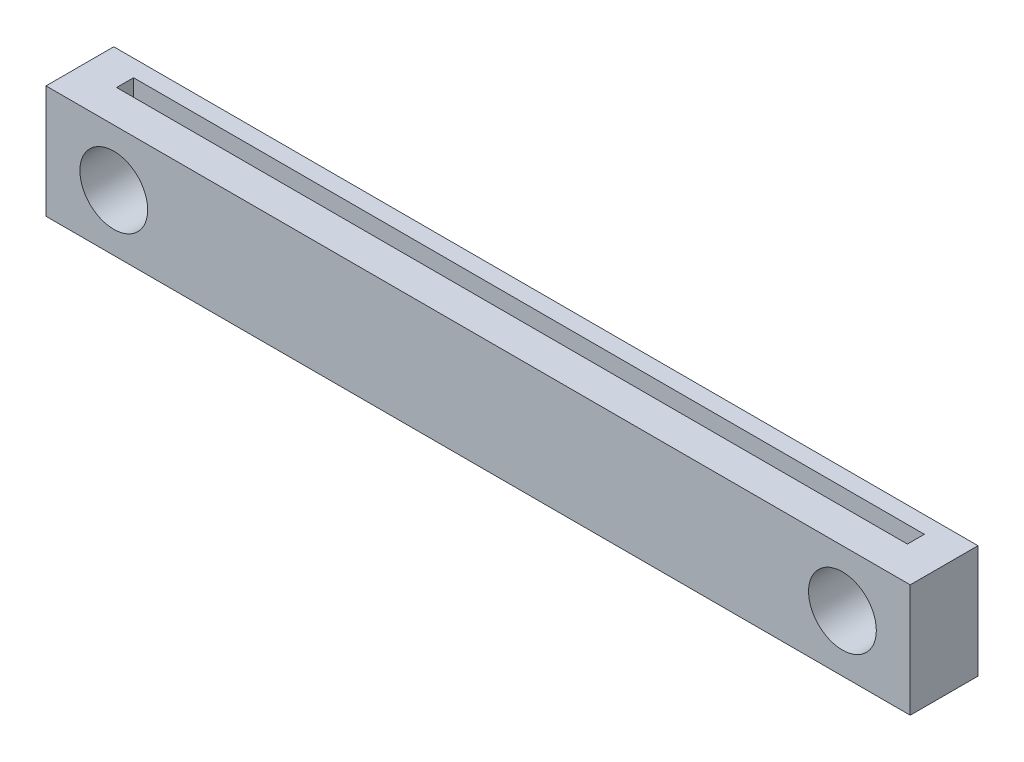
ISO-10303-21;
HEADER;
FILE_DESCRIPTION(('STEP AP214'),'2;1');
FILE_NAME('part.step','',(''),(''),'','','');
FILE_SCHEMA(('AUTOMOTIVE_DESIGN { 1 0 10303 214 1 1 1 1 }'));
ENDSEC;
DATA;
#1=APPLICATION_CONTEXT('core data for automotive mechanical design processes');
#2=APPLICATION_PROTOCOL_DEFINITION('international standard','automotive_design',2000,#1);
#3=PRODUCT_CONTEXT('',#1,'mechanical');
#4=PRODUCT('Part','Part','',(#3));
#5=PRODUCT_RELATED_PRODUCT_CATEGORY('part','',(#4));
#6=PRODUCT_DEFINITION_FORMATION('','',#4);
#7=PRODUCT_DEFINITION_CONTEXT('part definition',#1,'design');
#8=PRODUCT_DEFINITION('design','',#6,#7);
#9=PRODUCT_DEFINITION_SHAPE('','',#8);
#10=(LENGTH_UNIT() NAMED_UNIT(*) SI_UNIT(.MILLI.,.METRE.));
#11=(NAMED_UNIT(*) PLANE_ANGLE_UNIT() SI_UNIT($,.RADIAN.));
#12=(NAMED_UNIT(*) SI_UNIT($,.STERADIAN.) SOLID_ANGLE_UNIT());
#13=UNCERTAINTY_MEASURE_WITH_UNIT(LENGTH_MEASURE(1.E-05),#10,'distance_accuracy_value','');
#14=(GEOMETRIC_REPRESENTATION_CONTEXT(3) GLOBAL_UNCERTAINTY_ASSIGNED_CONTEXT((#13)) GLOBAL_UNIT_ASSIGNED_CONTEXT((#10,
#11,#12)) REPRESENTATION_CONTEXT('',''));
#15=CARTESIAN_POINT('',(0.,0.,0.));
#16=DIRECTION('',(0.,0.,1.));
#17=DIRECTION('',(1.,0.,0.));
#18=AXIS2_PLACEMENT_3D('',#15,#16,#17);
#19=CARTESIAN_POINT('',(-35.,-5.,6.));
#20=DIRECTION('',(0.,1.,0.));
#21=DIRECTION('',(0.,0.,1.));
#22=AXIS2_PLACEMENT_3D('',#19,#20,#21);
#23=PLANE('',#22);
#24=DIRECTION('',(-1.,0.,0.));
#25=VECTOR('',#24,1.);
#26=CARTESIAN_POINT('',(35.,-5.,3.));
#27=LINE('',#26,#25);
#28=CARTESIAN_POINT('',(35.,-5.,3.));
#29=VERTEX_POINT('',#28);
#30=CARTESIAN_POINT('',(-35.,-5.,3.));
#31=VERTEX_POINT('',#30);
#32=EDGE_CURVE('E151',#29,#31,#27,.T.);
#33=ORIENTED_EDGE('',*,*,#32,.F.);
#34=DIRECTION('',(0.,0.,1.));
#35=VECTOR('',#34,1.);
#36=CARTESIAN_POINT('',(35.,-5.,0.));
#37=LINE('',#36,#35);
#38=CARTESIAN_POINT('',(35.,-5.,1.5));
#39=VERTEX_POINT('',#38);
#40=EDGE_CURVE('E231',#39,#29,#37,.T.);
#41=ORIENTED_EDGE('',*,*,#40,.F.);
#42=DIRECTION('',(-1.,0.,0.));
#43=VECTOR('',#42,1.);
#44=CARTESIAN_POINT('',(35.,-5.,1.5));
#45=LINE('',#44,#43);
#46=CARTESIAN_POINT('',(-35.,-5.,1.5));
#47=VERTEX_POINT('',#46);
#48=EDGE_CURVE('E153',#39,#47,#45,.T.);
#49=ORIENTED_EDGE('',*,*,#48,.T.);
#50=DIRECTION('',(0.,0.,1.));
#51=VECTOR('',#50,1.);
#52=CARTESIAN_POINT('',(-35.,-5.,0.));
#53=LINE('',#52,#51);
#54=EDGE_CURVE('E208',#47,#31,#53,.T.);
#55=ORIENTED_EDGE('',*,*,#54,.T.);
#56=EDGE_LOOP('',(#33,#41,#49,#55));
#57=FACE_BOUND('',#56,.T.);
#58=DIRECTION('',(0.,0.,1.));
#59=VECTOR('',#58,1.);
#60=CARTESIAN_POINT('',(38.25,-5.,0.));
#61=LINE('',#60,#59);
#62=CARTESIAN_POINT('',(38.25,-5.,0.));
#63=VERTEX_POINT('',#62);
#64=CARTESIAN_POINT('',(38.25,-5.,6.));
#65=VERTEX_POINT('',#64);
#66=EDGE_CURVE('E254',#63,#65,#61,.T.);
#67=ORIENTED_EDGE('',*,*,#66,.T.);
#68=DIRECTION('',(1.,0.,0.));
#69=VECTOR('',#68,1.);
#70=CARTESIAN_POINT('',(-35.,-5.,6.));
#71=LINE('',#70,#69);
#72=CARTESIAN_POINT('',(-38.25,-5.,6.));
#73=VERTEX_POINT('',#72);
#74=EDGE_CURVE('E52',#73,#65,#71,.T.);
#75=ORIENTED_EDGE('',*,*,#74,.F.);
#76=DIRECTION('',(0.,0.,1.));
#77=VECTOR('',#76,1.);
#78=CARTESIAN_POINT('',(-38.25,-5.,0.));
#79=LINE('',#78,#77);
#80=CARTESIAN_POINT('',(-38.25,-5.,0.));
#81=VERTEX_POINT('',#80);
#82=EDGE_CURVE('E196',#81,#73,#79,.T.);
#83=ORIENTED_EDGE('',*,*,#82,.F.);
#84=DIRECTION('',(1.,0.,0.));
#85=VECTOR('',#84,1.);
#86=CARTESIAN_POINT('',(-35.,-5.,0.));
#87=LINE('',#86,#85);
#88=EDGE_CURVE('E102',#81,#63,#87,.T.);
#89=ORIENTED_EDGE('',*,*,#88,.T.);
#90=EDGE_LOOP('',(#67,#75,#83,#89));
#91=FACE_BOUND('',#90,.T.);
#92=ADVANCED_FACE('F44',(#57,#91),#23,.F.);
#93=CARTESIAN_POINT('',(-35.,5.,6.));
#94=DIRECTION('',(0.,-1.,0.));
#95=DIRECTION('',(0.,0.,-1.));
#96=AXIS2_PLACEMENT_3D('',#93,#94,#95);
#97=PLANE('',#96);
#98=DIRECTION('',(0.,0.,1.));
#99=VECTOR('',#98,1.);
#100=CARTESIAN_POINT('',(38.25,5.,0.));
#101=LINE('',#100,#99);
#102=CARTESIAN_POINT('',(38.25,5.,0.));
#103=VERTEX_POINT('',#102);
#104=CARTESIAN_POINT('',(38.25,5.,6.));
#105=VERTEX_POINT('',#104);
#106=EDGE_CURVE('E187',#103,#105,#101,.T.);
#107=ORIENTED_EDGE('',*,*,#106,.F.);
#108=DIRECTION('',(-1.,0.,0.));
#109=VECTOR('',#108,1.);
#110=CARTESIAN_POINT('',(-35.,5.,0.));
#111=LINE('',#110,#109);
#112=CARTESIAN_POINT('',(-38.25,5.,0.));
#113=VERTEX_POINT('',#112);
#114=EDGE_CURVE('E47',#103,#113,#111,.T.);
#115=ORIENTED_EDGE('',*,*,#114,.T.);
#116=DIRECTION('',(0.,0.,1.));
#117=VECTOR('',#116,1.);
#118=CARTESIAN_POINT('',(-38.25,5.,0.));
#119=LINE('',#118,#117);
#120=CARTESIAN_POINT('',(-38.25,5.,6.));
#121=VERTEX_POINT('',#120);
#122=EDGE_CURVE('E183',#113,#121,#119,.T.);
#123=ORIENTED_EDGE('',*,*,#122,.T.);
#124=DIRECTION('',(-1.,0.,0.));
#125=VECTOR('',#124,1.);
#126=CARTESIAN_POINT('',(-35.,5.,6.));
#127=LINE('',#126,#125);
#128=EDGE_CURVE('E12',#105,#121,#127,.T.);
#129=ORIENTED_EDGE('',*,*,#128,.F.);
#130=EDGE_LOOP('',(#107,#115,#123,#129));
#131=FACE_BOUND('',#130,.T.);
#132=DIRECTION('',(-1.,0.,0.));
#133=VECTOR('',#132,1.);
#134=CARTESIAN_POINT('',(35.,5.,1.5));
#135=LINE('',#134,#133);
#136=CARTESIAN_POINT('',(35.,5.,1.5));
#137=VERTEX_POINT('',#136);
#138=CARTESIAN_POINT('',(-35.,5.,1.5));
#139=VERTEX_POINT('',#138);
#140=EDGE_CURVE('E69',#137,#139,#135,.T.);
#141=ORIENTED_EDGE('',*,*,#140,.F.);
#142=DIRECTION('',(0.,0.,1.));
#143=VECTOR('',#142,1.);
#144=CARTESIAN_POINT('',(35.,5.,0.));
#145=LINE('',#144,#143);
#146=CARTESIAN_POINT('',(35.,5.,3.));
#147=VERTEX_POINT('',#146);
#148=EDGE_CURVE('E227',#137,#147,#145,.T.);
#149=ORIENTED_EDGE('',*,*,#148,.T.);
#150=DIRECTION('',(-1.,0.,0.));
#151=VECTOR('',#150,1.);
#152=CARTESIAN_POINT('',(35.,5.,3.));
#153=LINE('',#152,#151);
#154=CARTESIAN_POINT('',(-35.,5.,3.));
#155=VERTEX_POINT('',#154);
#156=EDGE_CURVE('E142',#147,#155,#153,.T.);
#157=ORIENTED_EDGE('',*,*,#156,.T.);
#158=DIRECTION('',(0.,0.,1.));
#159=VECTOR('',#158,1.);
#160=CARTESIAN_POINT('',(-35.,5.,0.));
#161=LINE('',#160,#159);
#162=EDGE_CURVE('E197',#139,#155,#161,.T.);
#163=ORIENTED_EDGE('',*,*,#162,.F.);
#164=EDGE_LOOP('',(#141,#149,#157,#163));
#165=FACE_BOUND('',#164,.T.);
#166=ADVANCED_FACE('F180',(#131,#165),#97,.F.);
#167=CARTESIAN_POINT('',(0.,0.,6.));
#168=DIRECTION('',(0.,0.,1.));
#169=DIRECTION('',(1.,0.,0.));
#170=AXIS2_PLACEMENT_3D('',#167,#168,#169);
#171=PLANE('',#170);
#172=CARTESIAN_POINT('',(-32.25,0.,6.));
#173=DIRECTION('',(0.,0.,1.));
#174=DIRECTION('',(1.,0.,0.));
#175=AXIS2_PLACEMENT_3D('',#172,#173,#174);
#176=CIRCLE('',#175,3.);
#177=CARTESIAN_POINT('',(-29.25,0.,6.));
#178=VERTEX_POINT('',#177);
#179=EDGE_CURVE('E211',#178,#178,#176,.T.);
#180=ORIENTED_EDGE('',*,*,#179,.F.);
#181=EDGE_LOOP('',(#180));
#182=FACE_BOUND('',#181,.T.);
#183=CARTESIAN_POINT('',(32.25,0.,6.));
#184=DIRECTION('',(0.,0.,1.));
#185=DIRECTION('',(1.,0.,0.));
#186=AXIS2_PLACEMENT_3D('',#183,#184,#185);
#187=CIRCLE('',#186,3.);
#188=CARTESIAN_POINT('',(35.25,0.,6.));
#189=VERTEX_POINT('',#188);
#190=EDGE_CURVE('E268',#189,#189,#187,.F.);
#191=ORIENTED_EDGE('',*,*,#190,.T.);
#192=EDGE_LOOP('',(#191));
#193=FACE_BOUND('',#192,.T.);
#194=DIRECTION('',(0.,-1.,0.));
#195=VECTOR('',#194,1.);
#196=CARTESIAN_POINT('',(-38.25,-5.,6.));
#197=LINE('',#196,#195);
#198=EDGE_CURVE('E195',#121,#73,#197,.T.);
#199=ORIENTED_EDGE('',*,*,#198,.T.);
#200=ORIENTED_EDGE('',*,*,#74,.T.);
#201=DIRECTION('',(0.,1.,0.));
#202=VECTOR('',#201,1.);
#203=CARTESIAN_POINT('',(38.25,-5.,6.));
#204=LINE('',#203,#202);
#205=EDGE_CURVE('E202',#65,#105,#204,.T.);
#206=ORIENTED_EDGE('',*,*,#205,.T.);
#207=ORIENTED_EDGE('',*,*,#128,.T.);
#208=EDGE_LOOP('',(#199,#200,#206,#207));
#209=FACE_BOUND('',#208,.T.);
#210=ADVANCED_FACE('F249',(#182,#193,#209),#171,.T.);
#211=CARTESIAN_POINT('',(0.,0.,0.));
#212=DIRECTION('',(0.,0.,1.));
#213=DIRECTION('',(1.,0.,0.));
#214=AXIS2_PLACEMENT_3D('',#211,#212,#213);
#215=PLANE('',#214);
#216=CARTESIAN_POINT('',(-32.25,0.,0.));
#217=DIRECTION('',(0.,0.,1.));
#218=DIRECTION('',(1.,0.,0.));
#219=AXIS2_PLACEMENT_3D('',#216,#217,#218);
#220=CIRCLE('',#219,3.);
#221=CARTESIAN_POINT('',(-29.25,0.,0.));
#222=VERTEX_POINT('',#221);
#223=EDGE_CURVE('E149',#222,#222,#220,.T.);
#224=ORIENTED_EDGE('',*,*,#223,.T.);
#225=EDGE_LOOP('',(#224));
#226=FACE_BOUND('',#225,.T.);
#227=CARTESIAN_POINT('',(32.25,0.,0.));
#228=DIRECTION('',(0.,0.,1.));
#229=DIRECTION('',(1.,0.,0.));
#230=AXIS2_PLACEMENT_3D('',#227,#228,#229);
#231=CIRCLE('',#230,3.);
#232=CARTESIAN_POINT('',(35.25,0.,0.));
#233=VERTEX_POINT('',#232);
#234=EDGE_CURVE('E265',#233,#233,#231,.F.);
#235=ORIENTED_EDGE('',*,*,#234,.F.);
#236=EDGE_LOOP('',(#235));
#237=FACE_BOUND('',#236,.T.);
#238=ORIENTED_EDGE('',*,*,#88,.F.);
#239=DIRECTION('',(0.,-1.,0.));
#240=VECTOR('',#239,1.);
#241=CARTESIAN_POINT('',(-38.25,-5.,0.));
#242=LINE('',#241,#240);
#243=EDGE_CURVE('E193',#113,#81,#242,.T.);
#244=ORIENTED_EDGE('',*,*,#243,.F.);
#245=ORIENTED_EDGE('',*,*,#114,.F.);
#246=DIRECTION('',(0.,1.,0.));
#247=VECTOR('',#246,1.);
#248=CARTESIAN_POINT('',(38.25,-5.,0.));
#249=LINE('',#248,#247);
#250=EDGE_CURVE('E205',#63,#103,#249,.T.);
#251=ORIENTED_EDGE('',*,*,#250,.F.);
#252=EDGE_LOOP('',(#238,#244,#245,#251));
#253=FACE_BOUND('',#252,.T.);
#254=ADVANCED_FACE('F199',(#226,#237,#253),#215,.F.);
#255=CARTESIAN_POINT('',(35.,5.,1.5));
#256=DIRECTION('',(0.,0.,-1.));
#257=DIRECTION('',(0.,1.,0.));
#258=AXIS2_PLACEMENT_3D('',#255,#256,#257);
#259=PLANE('',#258);
#260=DIRECTION('',(0.,-1.,0.));
#261=VECTOR('',#260,1.);
#262=CARTESIAN_POINT('',(-35.,5.,1.5));
#263=LINE('',#262,#261);
#264=CARTESIAN_POINT('',(-35.,3.5,1.5));
#265=VERTEX_POINT('',#264);
#266=EDGE_CURVE('E128',#139,#265,#263,.T.);
#267=ORIENTED_EDGE('',*,*,#266,.T.);
#268=DIRECTION('',(-1.,0.,0.));
#269=VECTOR('',#268,1.);
#270=CARTESIAN_POINT('',(35.,3.5,1.5));
#271=LINE('',#270,#269);
#272=CARTESIAN_POINT('',(35.,3.5,1.5));
#273=VERTEX_POINT('',#272);
#274=EDGE_CURVE('E118',#273,#265,#271,.T.);
#275=ORIENTED_EDGE('',*,*,#274,.F.);
#276=DIRECTION('',(0.,-1.,0.));
#277=VECTOR('',#276,1.);
#278=CARTESIAN_POINT('',(35.,5.,1.5));
#279=LINE('',#278,#277);
#280=EDGE_CURVE('E137',#137,#273,#279,.T.);
#281=ORIENTED_EDGE('',*,*,#280,.F.);
#282=ORIENTED_EDGE('',*,*,#140,.T.);
#283=EDGE_LOOP('',(#267,#275,#281,#282));
#284=FACE_BOUND('',#283,.T.);
#285=ADVANCED_FACE('F129',(#284),#259,.F.);
#286=CARTESIAN_POINT('',(35.,3.5,3.));
#287=DIRECTION('',(0.,0.,1.));
#288=DIRECTION('',(1.,0.,0.));
#289=AXIS2_PLACEMENT_3D('',#286,#287,#288);
#290=PLANE('',#289);
#291=DIRECTION('',(0.,1.,0.));
#292=VECTOR('',#291,1.);
#293=CARTESIAN_POINT('',(-35.,3.5,3.));
#294=LINE('',#293,#292);
#295=CARTESIAN_POINT('',(-35.,3.5,3.));
#296=VERTEX_POINT('',#295);
#297=EDGE_CURVE('E60',#296,#155,#294,.T.);
#298=ORIENTED_EDGE('',*,*,#297,.T.);
#299=ORIENTED_EDGE('',*,*,#156,.F.);
#300=DIRECTION('',(0.,1.,0.));
#301=VECTOR('',#300,1.);
#302=CARTESIAN_POINT('',(35.,3.5,3.));
#303=LINE('',#302,#301);
#304=CARTESIAN_POINT('',(35.,3.5,3.));
#305=VERTEX_POINT('',#304);
#306=EDGE_CURVE('E126',#305,#147,#303,.T.);
#307=ORIENTED_EDGE('',*,*,#306,.F.);
#308=DIRECTION('',(-1.,0.,0.));
#309=VECTOR('',#308,1.);
#310=CARTESIAN_POINT('',(35.,3.5,3.));
#311=LINE('',#310,#309);
#312=EDGE_CURVE('E125',#305,#296,#311,.T.);
#313=ORIENTED_EDGE('',*,*,#312,.T.);
#314=EDGE_LOOP('',(#298,#299,#307,#313));
#315=FACE_BOUND('',#314,.T.);
#316=ADVANCED_FACE('F233',(#315),#290,.F.);
#317=CARTESIAN_POINT('',(35.,3.5,1.5));
#318=DIRECTION('',(0.,-1.,0.));
#319=DIRECTION('',(0.,0.,-1.));
#320=AXIS2_PLACEMENT_3D('',#317,#318,#319);
#321=PLANE('',#320);
#322=DIRECTION('',(0.,0.,1.));
#323=VECTOR('',#322,1.);
#324=CARTESIAN_POINT('',(-35.,3.5,1.5));
#325=LINE('',#324,#323);
#326=EDGE_CURVE('E122',#265,#296,#325,.T.);
#327=ORIENTED_EDGE('',*,*,#326,.T.);
#328=ORIENTED_EDGE('',*,*,#312,.F.);
#329=DIRECTION('',(0.,0.,1.));
#330=VECTOR('',#329,1.);
#331=CARTESIAN_POINT('',(35.,3.5,1.5));
#332=LINE('',#331,#330);
#333=EDGE_CURVE('E124',#273,#305,#332,.T.);
#334=ORIENTED_EDGE('',*,*,#333,.F.);
#335=ORIENTED_EDGE('',*,*,#274,.T.);
#336=EDGE_LOOP('',(#327,#328,#334,#335));
#337=FACE_BOUND('',#336,.T.);
#338=ADVANCED_FACE('F119',(#337),#321,.F.);
#339=CARTESIAN_POINT('',(35.,-5.,1.5));
#340=DIRECTION('',(0.,0.,1.));
#341=DIRECTION('',(0.,-1.,0.));
#342=AXIS2_PLACEMENT_3D('',#339,#340,#341);
#343=PLANE('',#342);
#344=DIRECTION('',(0.,1.,0.));
#345=VECTOR('',#344,1.);
#346=CARTESIAN_POINT('',(-35.,-5.,1.5));
#347=LINE('',#346,#345);
#348=CARTESIAN_POINT('',(-35.,-3.5,1.5));
#349=VERTEX_POINT('',#348);
#350=EDGE_CURVE('E133',#47,#349,#347,.T.);
#351=ORIENTED_EDGE('',*,*,#350,.F.);
#352=ORIENTED_EDGE('',*,*,#48,.F.);
#353=DIRECTION('',(0.,1.,0.));
#354=VECTOR('',#353,1.);
#355=CARTESIAN_POINT('',(35.,-5.,1.5));
#356=LINE('',#355,#354);
#357=CARTESIAN_POINT('',(35.,-3.5,1.5));
#358=VERTEX_POINT('',#357);
#359=EDGE_CURVE('E161',#39,#358,#356,.T.);
#360=ORIENTED_EDGE('',*,*,#359,.T.);
#361=DIRECTION('',(-1.,0.,0.));
#362=VECTOR('',#361,1.);
#363=CARTESIAN_POINT('',(35.,-3.5,1.5));
#364=LINE('',#363,#362);
#365=EDGE_CURVE('E145',#358,#349,#364,.T.);
#366=ORIENTED_EDGE('',*,*,#365,.T.);
#367=EDGE_LOOP('',(#351,#352,#360,#366));
#368=FACE_BOUND('',#367,.T.);
#369=ADVANCED_FACE('F240',(#368),#343,.T.);
#370=CARTESIAN_POINT('',(35.,-3.5,1.5));
#371=DIRECTION('',(0.,-1.,0.));
#372=DIRECTION('',(0.,0.,-1.));
#373=AXIS2_PLACEMENT_3D('',#370,#371,#372);
#374=PLANE('',#373);
#375=DIRECTION('',(0.,0.,1.));
#376=VECTOR('',#375,1.);
#377=CARTESIAN_POINT('',(-35.,-3.5,1.5));
#378=LINE('',#377,#376);
#379=CARTESIAN_POINT('',(-35.,-3.5,3.));
#380=VERTEX_POINT('',#379);
#381=EDGE_CURVE('E160',#349,#380,#378,.T.);
#382=ORIENTED_EDGE('',*,*,#381,.F.);
#383=ORIENTED_EDGE('',*,*,#365,.F.);
#384=DIRECTION('',(0.,0.,1.));
#385=VECTOR('',#384,1.);
#386=CARTESIAN_POINT('',(35.,-3.5,1.5));
#387=LINE('',#386,#385);
#388=CARTESIAN_POINT('',(35.,-3.5,3.));
#389=VERTEX_POINT('',#388);
#390=EDGE_CURVE('E93',#358,#389,#387,.T.);
#391=ORIENTED_EDGE('',*,*,#390,.T.);
#392=DIRECTION('',(-1.,0.,0.));
#393=VECTOR('',#392,1.);
#394=CARTESIAN_POINT('',(35.,-3.5,3.));
#395=LINE('',#394,#393);
#396=EDGE_CURVE('E148',#389,#380,#395,.T.);
#397=ORIENTED_EDGE('',*,*,#396,.T.);
#398=EDGE_LOOP('',(#382,#383,#391,#397));
#399=FACE_BOUND('',#398,.T.);
#400=ADVANCED_FACE('F290',(#399),#374,.T.);
#401=CARTESIAN_POINT('',(35.,-3.5,3.));
#402=DIRECTION('',(0.,0.,-1.));
#403=DIRECTION('',(-1.,0.,0.));
#404=AXIS2_PLACEMENT_3D('',#401,#402,#403);
#405=PLANE('',#404);
#406=DIRECTION('',(0.,-1.,0.));
#407=VECTOR('',#406,1.);
#408=CARTESIAN_POINT('',(-35.,-3.5,3.));
#409=LINE('',#408,#407);
#410=EDGE_CURVE('E157',#380,#31,#409,.T.);
#411=ORIENTED_EDGE('',*,*,#410,.F.);
#412=ORIENTED_EDGE('',*,*,#396,.F.);
#413=DIRECTION('',(0.,-1.,0.));
#414=VECTOR('',#413,1.);
#415=CARTESIAN_POINT('',(35.,-3.5,3.));
#416=LINE('',#415,#414);
#417=EDGE_CURVE('E156',#389,#29,#416,.T.);
#418=ORIENTED_EDGE('',*,*,#417,.T.);
#419=ORIENTED_EDGE('',*,*,#32,.T.);
#420=EDGE_LOOP('',(#411,#412,#418,#419));
#421=FACE_BOUND('',#420,.T.);
#422=ADVANCED_FACE('F286',(#421),#405,.T.);
#423=CARTESIAN_POINT('',(-32.25,0.,0.));
#424=DIRECTION('',(0.,0.,1.));
#425=DIRECTION('',(1.,0.,0.));
#426=AXIS2_PLACEMENT_3D('',#423,#424,#425);
#427=CYLINDRICAL_SURFACE('',#426,3.);
#428=ORIENTED_EDGE('',*,*,#179,.T.);
#429=EDGE_LOOP('',(#428));
#430=FACE_BOUND('',#429,.T.);
#431=ORIENTED_EDGE('',*,*,#223,.F.);
#432=EDGE_LOOP('',(#431));
#433=FACE_BOUND('',#432,.T.);
#434=ADVANCED_FACE('F289',(#430,#433),#427,.F.);
#435=CARTESIAN_POINT('',(-35.,-5.,0.));
#436=DIRECTION('',(1.,0.,0.));
#437=DIRECTION('',(0.,0.,-1.));
#438=AXIS2_PLACEMENT_3D('',#435,#436,#437);
#439=PLANE('',#438);
#440=ORIENTED_EDGE('',*,*,#266,.F.);
#441=ORIENTED_EDGE('',*,*,#162,.T.);
#442=ORIENTED_EDGE('',*,*,#297,.F.);
#443=ORIENTED_EDGE('',*,*,#326,.F.);
#444=EDGE_LOOP('',(#440,#441,#442,#443));
#445=FACE_BOUND('',#444,.T.);
#446=ADVANCED_FACE('F135',(#445),#439,.T.);
#447=ORIENTED_EDGE('',*,*,#54,.F.);
#448=ORIENTED_EDGE('',*,*,#350,.T.);
#449=ORIENTED_EDGE('',*,*,#381,.T.);
#450=ORIENTED_EDGE('',*,*,#410,.T.);
#451=EDGE_LOOP('',(#447,#448,#449,#450));
#452=FACE_BOUND('',#451,.T.);
#453=ADVANCED_FACE('F303',(#452),#439,.T.);
#454=CARTESIAN_POINT('',(-38.25,-5.,0.));
#455=DIRECTION('',(-1.,0.,0.));
#456=DIRECTION('',(0.,0.,1.));
#457=AXIS2_PLACEMENT_3D('',#454,#455,#456);
#458=PLANE('',#457);
#459=ORIENTED_EDGE('',*,*,#198,.F.);
#460=ORIENTED_EDGE('',*,*,#122,.F.);
#461=ORIENTED_EDGE('',*,*,#243,.T.);
#462=ORIENTED_EDGE('',*,*,#82,.T.);
#463=EDGE_LOOP('',(#459,#460,#461,#462));
#464=FACE_BOUND('',#463,.T.);
#465=ADVANCED_FACE('F191',(#464),#458,.T.);
#466=CARTESIAN_POINT('',(35.,-5.,0.));
#467=DIRECTION('',(-1.,0.,0.));
#468=DIRECTION('',(0.,0.,1.));
#469=AXIS2_PLACEMENT_3D('',#466,#467,#468);
#470=PLANE('',#469);
#471=ORIENTED_EDGE('',*,*,#417,.F.);
#472=ORIENTED_EDGE('',*,*,#390,.F.);
#473=ORIENTED_EDGE('',*,*,#359,.F.);
#474=ORIENTED_EDGE('',*,*,#40,.T.);
#475=EDGE_LOOP('',(#471,#472,#473,#474));
#476=FACE_BOUND('',#475,.T.);
#477=ADVANCED_FACE('F308',(#476),#470,.T.);
#478=ORIENTED_EDGE('',*,*,#148,.F.);
#479=ORIENTED_EDGE('',*,*,#280,.T.);
#480=ORIENTED_EDGE('',*,*,#333,.T.);
#481=ORIENTED_EDGE('',*,*,#306,.T.);
#482=EDGE_LOOP('',(#478,#479,#480,#481));
#483=FACE_BOUND('',#482,.T.);
#484=ADVANCED_FACE('F225',(#483),#470,.T.);
#485=CARTESIAN_POINT('',(38.25,-5.,0.));
#486=DIRECTION('',(1.,0.,0.));
#487=DIRECTION('',(0.,0.,-1.));
#488=AXIS2_PLACEMENT_3D('',#485,#486,#487);
#489=PLANE('',#488);
#490=ORIENTED_EDGE('',*,*,#205,.F.);
#491=ORIENTED_EDGE('',*,*,#66,.F.);
#492=ORIENTED_EDGE('',*,*,#250,.T.);
#493=ORIENTED_EDGE('',*,*,#106,.T.);
#494=EDGE_LOOP('',(#490,#491,#492,#493));
#495=FACE_BOUND('',#494,.T.);
#496=ADVANCED_FACE('F261',(#495),#489,.T.);
#497=CARTESIAN_POINT('',(32.25,0.,0.));
#498=DIRECTION('',(0.,0.,1.));
#499=DIRECTION('',(1.,0.,0.));
#500=AXIS2_PLACEMENT_3D('',#497,#498,#499);
#501=CYLINDRICAL_SURFACE('',#500,3.);
#502=ORIENTED_EDGE('',*,*,#234,.T.);
#503=EDGE_LOOP('',(#502));
#504=FACE_BOUND('',#503,.T.);
#505=ORIENTED_EDGE('',*,*,#190,.F.);
#506=EDGE_LOOP('',(#505));
#507=FACE_BOUND('',#506,.T.);
#508=ADVANCED_FACE('F274',(#504,#507),#501,.F.);
#509=CLOSED_SHELL('',(#92,#166,#210,#254,#285,#316,#338,#369,#400,#422,#434,#446,#453,#465,#477,
#484,#496,#508));
#510=MANIFOLD_SOLID_BREP('B2',#509);
#511=ADVANCED_BREP_SHAPE_REPRESENTATION('',(#18,#510),#14);
#512=SHAPE_DEFINITION_REPRESENTATION(#9,#511);
ENDSEC;
END-ISO-10303-21;
